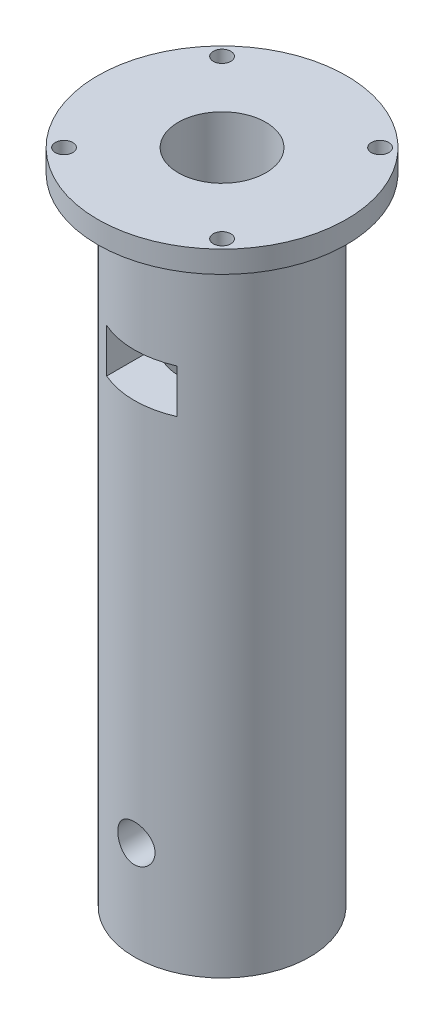
ISO-10303-21;
HEADER;
FILE_DESCRIPTION(('STEP AP214'),'2;1');
FILE_NAME('part.step','',(''),(''),'','','');
FILE_SCHEMA(('AUTOMOTIVE_DESIGN { 1 0 10303 214 1 1 1 1 }'));
ENDSEC;
DATA;
#1=APPLICATION_CONTEXT('core data for automotive mechanical design processes');
#2=APPLICATION_PROTOCOL_DEFINITION('international standard','automotive_design',2000,#1);
#3=PRODUCT_CONTEXT('',#1,'mechanical');
#4=PRODUCT('Part','Part','',(#3));
#5=PRODUCT_RELATED_PRODUCT_CATEGORY('part','',(#4));
#6=PRODUCT_DEFINITION_FORMATION('','',#4);
#7=PRODUCT_DEFINITION_CONTEXT('part definition',#1,'design');
#8=PRODUCT_DEFINITION('design','',#6,#7);
#9=PRODUCT_DEFINITION_SHAPE('','',#8);
#10=(LENGTH_UNIT() NAMED_UNIT(*) SI_UNIT(.MILLI.,.METRE.));
#11=(NAMED_UNIT(*) PLANE_ANGLE_UNIT() SI_UNIT($,.RADIAN.));
#12=(NAMED_UNIT(*) SI_UNIT($,.STERADIAN.) SOLID_ANGLE_UNIT());
#13=UNCERTAINTY_MEASURE_WITH_UNIT(LENGTH_MEASURE(1.E-05),#10,'distance_accuracy_value','');
#14=(GEOMETRIC_REPRESENTATION_CONTEXT(3) GLOBAL_UNCERTAINTY_ASSIGNED_CONTEXT((#13)) GLOBAL_UNIT_ASSIGNED_CONTEXT((#10,
#11,#12)) REPRESENTATION_CONTEXT('',''));
#15=CARTESIAN_POINT('',(0.,0.,0.));
#16=DIRECTION('',(0.,0.,1.));
#17=DIRECTION('',(1.,0.,0.));
#18=AXIS2_PLACEMENT_3D('',#15,#16,#17);
#19=CARTESIAN_POINT('',(0.,45.,0.));
#20=DIRECTION('',(0.,-1.,0.));
#21=DIRECTION('',(0.,0.,-1.));
#22=AXIS2_PLACEMENT_3D('',#19,#20,#21);
#23=CYLINDRICAL_SURFACE('',#22,20.);
#24=CARTESIAN_POINT('',(0.,145.,0.));
#25=DIRECTION('',(0.,1.,0.));
#26=DIRECTION('',(0.,0.,1.));
#27=AXIS2_PLACEMENT_3D('',#24,#25,#26);
#28=CIRCLE('',#27,20.);
#29=CARTESIAN_POINT('',(0.,145.,20.));
#30=VERTEX_POINT('',#29);
#31=EDGE_CURVE('E200',#30,#30,#28,.T.);
#32=ORIENTED_EDGE('',*,*,#31,.F.);
#33=EDGE_LOOP('',(#32));
#34=FACE_BOUND('',#33,.T.);
#35=CARTESIAN_POINT('',(0.,26.75,-20.));
#36=CARTESIAN_POINT('',(-0.235882160273438,26.7499917205021,-19.999995634548));
#37=CARTESIAN_POINT('',(-0.471865909834786,26.7302958936483,-19.9957844191217));
#38=CARTESIAN_POINT('',(-0.937141547842627,26.6521081818069,-19.9793916051107));
#39=CARTESIAN_POINT('',(-1.16642833988831,26.5935875148462,-19.9672040935584));
#40=CARTESIAN_POINT('',(-1.61151761134815,26.4396569333726,-19.936217016643));
#41=CARTESIAN_POINT('',(-1.82733352136637,26.3442844655771,-19.9174241649992));
#42=CARTESIAN_POINT('',(-2.23989055102827,26.1194738600792,-19.8752596894785));
#43=CARTESIAN_POINT('',(-2.43663238143512,25.990036992397,-19.8518882363135));
#44=CARTESIAN_POINT('',(-2.80845579164892,25.6986893561894,-19.8027339133299));
#45=CARTESIAN_POINT('',(-2.98320598382066,25.5363604343719,-19.7769225435023));
#46=CARTESIAN_POINT('',(-3.30321351462314,25.1847347309497,-19.726000511966));
#47=CARTESIAN_POINT('',(-3.4484683390828,24.99543565276,-19.7008899101478));
#48=CARTESIAN_POINT('',(-3.706806366207,24.592815620429,-19.6539325008399));
#49=CARTESIAN_POINT('',(-3.81954007648782,24.3792657719164,-19.632122266365));
#50=CARTESIAN_POINT('',(-4.00739494471044,23.9357135911783,-19.5946426811725));
#51=CARTESIAN_POINT('',(-4.08252032991898,23.7057131113665,-19.5789726403254));
#52=CARTESIAN_POINT('',(-4.19193740664846,23.2393734729951,-19.5558372982232));
#53=CARTESIAN_POINT('',(-4.22681404286624,23.0031775071053,-19.5482545883317));
#54=CARTESIAN_POINT('',(-4.25656176589869,22.5281744386785,-19.541799580002));
#55=CARTESIAN_POINT('',(-4.25143748517181,22.2893676416973,-19.5429262729382));
#56=CARTESIAN_POINT('',(-4.2018003152417,21.8202465759967,-19.5536563396257));
#57=CARTESIAN_POINT('',(-4.15796385505466,21.58985690344,-19.5631141344988));
#58=CARTESIAN_POINT('',(-4.03321699913495,21.1397783208176,-19.5892109090226));
#59=CARTESIAN_POINT('',(-3.95230462854138,20.9200899814517,-19.6058502711991));
#60=CARTESIAN_POINT('',(-3.7550732225969,20.4957323090477,-19.6445806364762));
#61=CARTESIAN_POINT('',(-3.63849136058396,20.2911889558839,-19.666711869015));
#62=CARTESIAN_POINT('',(-3.37341532036452,19.9043168250017,-19.7139072819128));
#63=CARTESIAN_POINT('',(-3.22491702414367,19.7219909186481,-19.7389718405537));
#64=CARTESIAN_POINT('',(-2.89662873087614,19.3808317876653,-19.7898364672849));
#65=CARTESIAN_POINT('',(-2.7162628010091,19.2225529321306,-19.8156411159268));
#66=CARTESIAN_POINT('',(-2.3312591445285,18.9384031135338,-19.8646124394905));
#67=CARTESIAN_POINT('',(-2.12662102486609,18.8125326753784,-19.8877790716819));
#68=CARTESIAN_POINT('',(-1.69822610079556,18.596647564086,-19.9289328017472));
#69=CARTESIAN_POINT('',(-1.4744332622891,18.506702357804,-19.9469098463489));
#70=CARTESIAN_POINT('',(-1.01444427212059,18.3658448663377,-19.975583671037));
#71=CARTESIAN_POINT('',(-0.778249825473837,18.3149272304461,-19.9862814490933));
#72=CARTESIAN_POINT('',(-0.304920474051216,18.2543692167667,-19.9990503897357));
#73=CARTESIAN_POINT('',(-0.0678866616700645,18.2439710985793,-20.0012798940608));
#74=CARTESIAN_POINT('',(0.404531063627258,18.2626979560572,-19.997303462698));
#75=CARTESIAN_POINT('',(0.639915080891646,18.2918204089846,-19.9910980654396));
#76=CARTESIAN_POINT('',(1.09986348604265,18.3881329457467,-19.971048714765));
#77=CARTESIAN_POINT('',(1.32451423637387,18.4549285413183,-19.9572839566272));
#78=CARTESIAN_POINT('',(1.7594245366201,18.6242557401821,-19.9236553710886));
#79=CARTESIAN_POINT('',(1.96968290728063,18.7267902675973,-19.9037910446432));
#80=CARTESIAN_POINT('',(2.37299466325105,18.9662841411997,-19.8597746945902));
#81=CARTESIAN_POINT('',(2.5657753745508,19.1036924197117,-19.835568065625));
#82=CARTESIAN_POINT('',(2.92581438161099,19.4084387504517,-19.7856691939394));
#83=CARTESIAN_POINT('',(3.09306955679065,19.5757804567165,-19.7599767701044));
#84=CARTESIAN_POINT('',(3.40028132560014,19.9391114616347,-19.7094595502391));
#85=CARTESIAN_POINT('',(3.53971470209231,20.1355468972746,-19.6846575011254));
#86=CARTESIAN_POINT('',(3.78361259042945,20.5494933847941,-19.6392395261037));
#87=CARTESIAN_POINT('',(3.88807858308299,20.7670035436921,-19.6186234229427));
#88=CARTESIAN_POINT('',(4.05839186252609,21.2157776462395,-19.5841010629306));
#89=CARTESIAN_POINT('',(4.12445130926692,21.4469581057331,-19.5701580208428));
#90=CARTESIAN_POINT('',(4.21670597681273,21.9174700877127,-19.5504899175105));
#91=CARTESIAN_POINT('',(4.24290716364494,22.1568003848383,-19.5447636263811));
#92=CARTESIAN_POINT('',(4.25445882074592,22.6315507853017,-19.5422517596013));
#93=CARTESIAN_POINT('',(4.24063785769818,22.8669501510923,-19.5452848378007));
#94=CARTESIAN_POINT('',(4.17438177976061,23.3319845849334,-19.5595415222697));
#95=CARTESIAN_POINT('',(4.12194706810125,23.5616197131519,-19.5707650430092));
#96=CARTESIAN_POINT('',(3.9803419391464,24.007993740043,-19.6000520686151));
#97=CARTESIAN_POINT('',(3.89128563781047,24.2247703270653,-19.6180943117547));
#98=CARTESIAN_POINT('',(3.67906583788464,24.640430642762,-19.658995430057));
#99=CARTESIAN_POINT('',(3.55589901837016,24.8393126267584,-19.6818547741501));
#100=CARTESIAN_POINT('',(3.27617829793216,25.2176369818626,-19.7303606499532));
#101=CARTESIAN_POINT('',(3.11903117114265,25.3966350637243,-19.7560521086617));
#102=CARTESIAN_POINT('',(2.77702080075196,25.7259927338104,-19.8070186912309));
#103=CARTESIAN_POINT('',(2.59215117602445,25.8763457104056,-19.8322937177473));
#104=CARTESIAN_POINT('',(2.19725114425488,26.1458785672646,-19.8799415519951));
#105=CARTESIAN_POINT('',(1.98694346554049,26.2646594199828,-19.9022755605413));
#106=CARTESIAN_POINT('',(1.548924146271,26.4650003636837,-19.9411384569439));
#107=CARTESIAN_POINT('',(1.32122767563642,26.5465924745331,-19.9576723359316));
#108=CARTESIAN_POINT('',(0.911002541574341,26.6552643600848,-19.9800317732193));
#109=CARTESIAN_POINT('',(0.730734728352712,26.6907239862831,-19.9874743622358));
#110=CARTESIAN_POINT('',(0.366998358221396,26.7380945590935,-19.9974600765193));
#111=CARTESIAN_POINT('',(0.183529928855793,26.750006441927,-20.0000033965735));
#112=CARTESIAN_POINT('',(0.,26.75,-20.));
#113=B_SPLINE_CURVE_WITH_KNOTS('',3,(#35,#36,#37,#38,#39,#40,#41,#42,#43,#44,#45,#46,#47,#48,
#49,#50,#51,#52,#53,#54,#55,#56,#57,#58,#59,#60,#61,#62,#63,#64,#65,#66,#67,#68,#69,#70,#71,#72,
#73,#74,#75,#76,#77,#78,#79,#80,#81,#82,#83,#84,#85,#86,#87,#88,#89,#90,#91,#92,#93,#94,#95,#96,
#97,#98,#99,#100,#101,#102,#103,#104,#105,#106,#107,#108,#109,#110,#111,#112),.UNSPECIFIED.,.T.,
.F.,(4,2,2,2,2,2,2,2,2,2,2,2,2,2,2,2,2,2,2,2,2,2,2,2,2,2,2,2,2,2,2,2,2,2,2,2,2,2,4),(0.,
0.706974821530038,1.41447433038575,2.12125680084935,2.82801292413439,3.54439188883226,
4.26083189172154,4.98470651704243,5.70849975882414,6.42163593849384,7.13468953193895,
7.83552493982339,8.53639768228291,9.24256444453978,9.94882237463958,10.6694706484024,
11.3901305934923,12.1121773742571,12.8341251441853,13.5425053530055,14.250840345535,
14.9518922730208,15.6530015733315,16.3636397455873,17.0743647262229,17.7974044480911,
18.5204135465957,19.2393897935185,19.9582584127106,20.6623515836126,21.3664374020091,
22.0683456578021,22.7703222738673,23.4857180270857,24.2012787025927,24.9254939602125,
25.649084478056,26.1991735460672,26.7492407429584),.UNSPECIFIED.);
#114=CARTESIAN_POINT('',(0.,26.75,-20.));
#115=VERTEX_POINT('',#114);
#116=EDGE_CURVE('E162',#115,#115,#113,.T.);
#117=ORIENTED_EDGE('',*,*,#116,.T.);
#118=EDGE_LOOP('',(#117));
#119=FACE_BOUND('',#118,.T.);
#120=CARTESIAN_POINT('',(0.,18.25,20.));
#121=CARTESIAN_POINT('',(-0.235882160273438,18.2500082794979,19.999995634548));
#122=CARTESIAN_POINT('',(-0.471865909834786,18.2697041063517,19.9957844191217));
#123=CARTESIAN_POINT('',(-0.937141547842627,18.3478918181931,19.9793916051107));
#124=CARTESIAN_POINT('',(-1.16642833988831,18.4064124851538,19.9672040935584));
#125=CARTESIAN_POINT('',(-1.61151761134815,18.5603430666274,19.936217016643));
#126=CARTESIAN_POINT('',(-1.82733352136637,18.6557155344229,19.9174241649992));
#127=CARTESIAN_POINT('',(-2.23989055102827,18.8805261399208,19.8752596894785));
#128=CARTESIAN_POINT('',(-2.43663238143512,19.009963007603,19.8518882363135));
#129=CARTESIAN_POINT('',(-2.80845579164892,19.3013106438106,19.8027339133299));
#130=CARTESIAN_POINT('',(-2.98320598382066,19.4636395656281,19.7769225435023));
#131=CARTESIAN_POINT('',(-3.30321351462314,19.8152652690503,19.726000511966));
#132=CARTESIAN_POINT('',(-3.4484683390828,20.00456434724,19.7008899101478));
#133=CARTESIAN_POINT('',(-3.706806366207,20.407184379571,19.6539325008399));
#134=CARTESIAN_POINT('',(-3.81954007648782,20.6207342280836,19.632122266365));
#135=CARTESIAN_POINT('',(-4.00739494471043,21.0642864088217,19.5946426811725));
#136=CARTESIAN_POINT('',(-4.08252032991898,21.2942868886335,19.5789726403254));
#137=CARTESIAN_POINT('',(-4.19193740664846,21.7606265270049,19.5558372982232));
#138=CARTESIAN_POINT('',(-4.22681404286624,21.9968224928947,19.5482545883317));
#139=CARTESIAN_POINT('',(-4.25656176589869,22.4718255613215,19.541799580002));
#140=CARTESIAN_POINT('',(-4.25143748517181,22.7106323583027,19.5429262729382));
#141=CARTESIAN_POINT('',(-4.2018003152417,23.1797534240033,19.5536563396257));
#142=CARTESIAN_POINT('',(-4.15796385505466,23.41014309656,19.5631141344988));
#143=CARTESIAN_POINT('',(-4.03321699913495,23.8602216791824,19.5892109090226));
#144=CARTESIAN_POINT('',(-3.95230462854138,24.0799100185483,19.6058502711991));
#145=CARTESIAN_POINT('',(-3.7550732225969,24.5042676909523,19.6445806364762));
#146=CARTESIAN_POINT('',(-3.63849136058396,24.7088110441161,19.666711869015));
#147=CARTESIAN_POINT('',(-3.37341532036452,25.0956831749983,19.7139072819128));
#148=CARTESIAN_POINT('',(-3.22491702414367,25.2780090813519,19.7389718405537));
#149=CARTESIAN_POINT('',(-2.89662873087614,25.6191682123347,19.7898364672849));
#150=CARTESIAN_POINT('',(-2.7162628010091,25.7774470678694,19.8156411159268));
#151=CARTESIAN_POINT('',(-2.3312591445285,26.0615968864662,19.8646124394905));
#152=CARTESIAN_POINT('',(-2.12662102486609,26.1874673246216,19.8877790716819));
#153=CARTESIAN_POINT('',(-1.69822610079555,26.403352435914,19.9289328017472));
#154=CARTESIAN_POINT('',(-1.4744332622891,26.493297642196,19.9469098463489));
#155=CARTESIAN_POINT('',(-1.01444427212058,26.6341551336623,19.975583671037));
#156=CARTESIAN_POINT('',(-0.778249825473835,26.6850727695539,19.9862814490933));
#157=CARTESIAN_POINT('',(-0.304920474051215,26.7456307832333,19.9990503897357));
#158=CARTESIAN_POINT('',(-0.0678866616700645,26.7560289014207,20.0012798940608));
#159=CARTESIAN_POINT('',(0.404531063627257,26.7373020439428,19.997303462698));
#160=CARTESIAN_POINT('',(0.639915080891646,26.7081795910154,19.9910980654396));
#161=CARTESIAN_POINT('',(1.09986348604265,26.6118670542533,19.971048714765));
#162=CARTESIAN_POINT('',(1.32451423637387,26.5450714586817,19.9572839566272));
#163=CARTESIAN_POINT('',(1.7594245366201,26.3757442598179,19.9236553710886));
#164=CARTESIAN_POINT('',(1.96968290728063,26.2732097324027,19.9037910446432));
#165=CARTESIAN_POINT('',(2.37299466325105,26.0337158588003,19.8597746945902));
#166=CARTESIAN_POINT('',(2.5657753745508,25.8963075802883,19.835568065625));
#167=CARTESIAN_POINT('',(2.92581438161099,25.5915612495483,19.7856691939394));
#168=CARTESIAN_POINT('',(3.09306955679065,25.4242195432835,19.7599767701044));
#169=CARTESIAN_POINT('',(3.40028132560014,25.0608885383653,19.7094595502391));
#170=CARTESIAN_POINT('',(3.53971470209231,24.8644531027254,19.6846575011254));
#171=CARTESIAN_POINT('',(3.78361259042945,24.4505066152059,19.6392395261037));
#172=CARTESIAN_POINT('',(3.88807858308299,24.2329964563079,19.6186234229427));
#173=CARTESIAN_POINT('',(4.05839186252609,23.7842223537605,19.5841010629306));
#174=CARTESIAN_POINT('',(4.12445130926692,23.5530418942669,19.5701580208428));
#175=CARTESIAN_POINT('',(4.21670597681273,23.0825299122873,19.5504899175105));
#176=CARTESIAN_POINT('',(4.24290716364494,22.8431996151617,19.5447636263811));
#177=CARTESIAN_POINT('',(4.25445882074592,22.3684492146983,19.5422517596013));
#178=CARTESIAN_POINT('',(4.24063785769818,22.1330498489077,19.5452848378007));
#179=CARTESIAN_POINT('',(4.17438177976061,21.6680154150666,19.5595415222697));
#180=CARTESIAN_POINT('',(4.12194706810125,21.4383802868481,19.5707650430092));
#181=CARTESIAN_POINT('',(3.9803419391464,20.992006259957,19.6000520686151));
#182=CARTESIAN_POINT('',(3.89128563781047,20.7752296729347,19.6180943117547));
#183=CARTESIAN_POINT('',(3.67906583788464,20.359569357238,19.658995430057));
#184=CARTESIAN_POINT('',(3.55589901837016,20.1606873732416,19.6818547741501));
#185=CARTESIAN_POINT('',(3.27617829793216,19.7823630181374,19.7303606499532));
#186=CARTESIAN_POINT('',(3.11903117114265,19.6033649362757,19.7560521086616));
#187=CARTESIAN_POINT('',(2.77702080075196,19.2740072661896,19.8070186912309));
#188=CARTESIAN_POINT('',(2.59215117602445,19.1236542895944,19.8322937177474));
#189=CARTESIAN_POINT('',(2.19725114425488,18.8541214327354,19.8799415519951));
#190=CARTESIAN_POINT('',(1.98694346554049,18.7353405800172,19.9022755605413));
#191=CARTESIAN_POINT('',(1.548924146271,18.5349996363163,19.9411384569439));
#192=CARTESIAN_POINT('',(1.32122767563642,18.4534075254669,19.9576723359316));
#193=CARTESIAN_POINT('',(0.911002541574342,18.3447356399152,19.9800317732193));
#194=CARTESIAN_POINT('',(0.730734728352713,18.3092760137169,19.9874743622358));
#195=CARTESIAN_POINT('',(0.366998358221397,18.2619054409065,19.9974600765193));
#196=CARTESIAN_POINT('',(0.183529928855794,18.249993558073,20.0000033965735));
#197=CARTESIAN_POINT('',(0.,18.25,20.));
#198=B_SPLINE_CURVE_WITH_KNOTS('',3,(#120,#121,#122,#123,#124,#125,#126,#127,#128,#129,#130,
#131,#132,#133,#134,#135,#136,#137,#138,#139,#140,#141,#142,#143,#144,#145,#146,#147,#148,#149,
#150,#151,#152,#153,#154,#155,#156,#157,#158,#159,#160,#161,#162,#163,#164,#165,#166,#167,#168,
#169,#170,#171,#172,#173,#174,#175,#176,#177,#178,#179,#180,#181,#182,#183,#184,#185,#186,#187,
#188,#189,#190,#191,#192,#193,#194,#195,#196,#197),.UNSPECIFIED.,.T.,.F.,(4,2,2,2,2,2,2,2,2,2,2,
2,2,2,2,2,2,2,2,2,2,2,2,2,2,2,2,2,2,2,2,2,2,2,2,2,2,2,4),(0.,0.706974821530038,1.41447433038575,
2.12125680084935,2.8280129241344,3.54439188883226,4.26083189172155,4.98470651704243,
5.70849975882414,6.42163593849384,7.13468953193895,7.83552493982339,8.53639768228291,
9.24256444453978,9.94882237463958,10.6694706484024,11.3901305934923,12.1121773742571,
12.8341251441853,13.5425053530055,14.250840345535,14.9518922730208,15.6530015733315,
16.3636397455873,17.0743647262229,17.7974044480911,18.5204135465957,19.2393897935185,
19.9582584127106,20.6623515836126,21.3664374020091,22.0683456578021,22.7703222738673,
23.4857180270857,24.2012787025927,24.9254939602125,25.649084478056,26.1991735460672,
26.7492407429584),.UNSPECIFIED.);
#199=CARTESIAN_POINT('',(0.,18.25,20.));
#200=VERTEX_POINT('',#199);
#201=EDGE_CURVE('E171',#200,#200,#198,.T.);
#202=ORIENTED_EDGE('',*,*,#201,.T.);
#203=EDGE_LOOP('',(#202));
#204=FACE_BOUND('',#203,.T.);
#205=CARTESIAN_POINT('',(0.,0.,0.));
#206=DIRECTION('',(0.,1.,0.));
#207=DIRECTION('',(0.,0.,1.));
#208=AXIS2_PLACEMENT_3D('',#205,#206,#207);
#209=CIRCLE('',#208,20.);
#210=CARTESIAN_POINT('',(0.,0.,20.));
#211=VERTEX_POINT('',#210);
#212=EDGE_CURVE('E231',#211,#211,#209,.T.);
#213=ORIENTED_EDGE('',*,*,#212,.T.);
#214=EDGE_LOOP('',(#213));
#215=FACE_BOUND('',#214,.T.);
#216=DIRECTION('',(0.,-1.,0.));
#217=VECTOR('',#216,1.);
#218=CARTESIAN_POINT('',(-8.,45.,18.3303027798234));
#219=LINE('',#218,#217);
#220=CARTESIAN_POINT('',(-8.,120.,18.3303027798234));
#221=VERTEX_POINT('',#220);
#222=CARTESIAN_POINT('',(-8.,110.,18.3303027798234));
#223=VERTEX_POINT('',#222);
#224=EDGE_CURVE('E103',#221,#223,#219,.T.);
#225=ORIENTED_EDGE('',*,*,#224,.F.);
#226=CARTESIAN_POINT('',(0.,120.,0.));
#227=DIRECTION('',(0.,-1.,0.));
#228=DIRECTION('',(0.,0.,-1.));
#229=AXIS2_PLACEMENT_3D('',#226,#227,#228);
#230=CIRCLE('',#229,20.);
#231=CARTESIAN_POINT('',(8.,120.,18.3303027798234));
#232=VERTEX_POINT('',#231);
#233=EDGE_CURVE('E92',#232,#221,#230,.T.);
#234=ORIENTED_EDGE('',*,*,#233,.F.);
#235=DIRECTION('',(0.,-1.,0.));
#236=VECTOR('',#235,1.);
#237=CARTESIAN_POINT('',(8.00000000000002,45.,18.3303027798234));
#238=LINE('',#237,#236);
#239=CARTESIAN_POINT('',(8.,110.,18.3303027798234));
#240=VERTEX_POINT('',#239);
#241=EDGE_CURVE('E98',#240,#232,#238,.F.);
#242=ORIENTED_EDGE('',*,*,#241,.F.);
#243=CARTESIAN_POINT('',(0.,110.,0.));
#244=DIRECTION('',(0.,1.,0.));
#245=DIRECTION('',(0.,0.,1.));
#246=AXIS2_PLACEMENT_3D('',#243,#244,#245);
#247=CIRCLE('',#246,20.);
#248=EDGE_CURVE('E110',#223,#240,#247,.T.);
#249=ORIENTED_EDGE('',*,*,#248,.F.);
#250=EDGE_LOOP('',(#225,#234,#242,#249));
#251=FACE_BOUND('',#250,.T.);
#252=ADVANCED_FACE('F53',(#34,#119,#204,#215,#251),#23,.T.);
#253=CARTESIAN_POINT('',(0.,45.,0.));
#254=DIRECTION('',(0.,-1.,0.));
#255=DIRECTION('',(0.,0.,-1.));
#256=AXIS2_PLACEMENT_3D('',#253,#254,#255);
#257=CYLINDRICAL_SURFACE('',#256,10.);
#258=CARTESIAN_POINT('',(0.,26.75,-10.));
#259=CARTESIAN_POINT('',(-0.113677010701556,26.7499991489818,-9.9999993202227));
#260=CARTESIAN_POINT('',(-0.22739000284068,26.745432746214,-9.99805623880879));
#261=CARTESIAN_POINT('',(-0.454001998651723,26.727211761547,-9.99033301490753));
#262=CARTESIAN_POINT('',(-0.566900458780561,26.7135515928012,-9.98455051363963));
#263=CARTESIAN_POINT('',(-0.79123203865508,26.6772455171717,-9.96928310683869));
#264=CARTESIAN_POINT('',(-0.902661766499217,26.6545816486137,-9.95979080115523));
#265=CARTESIAN_POINT('',(-1.12303885960079,26.6005099312634,-9.93735816549744));
#266=CARTESIAN_POINT('',(-1.23198519049179,26.5690985084824,-9.92441642628079));
#267=CARTESIAN_POINT('',(-1.55313632601812,26.4624375156391,-9.88099824492704));
#268=CARTESIAN_POINT('',(-1.76068359514815,26.3745916871478,-9.84585421260864));
#269=CARTESIAN_POINT('',(-2.15778395929118,26.168326313854,-9.7665299348061));
#270=CARTESIAN_POINT('',(-2.34734208206892,26.0499153462874,-9.72235222508786));
#271=CARTESIAN_POINT('',(-2.71333279483057,25.7794096949561,-9.62679879188588));
#272=CARTESIAN_POINT('',(-2.8887188806256,25.6259855552551,-9.575181288256));
#273=CARTESIAN_POINT('',(-3.21223227660989,25.2924935524296,-9.47156108494723));
#274=CARTESIAN_POINT('',(-3.36034469204757,25.1124112269475,-9.41955819082848));
#275=CARTESIAN_POINT('',(-3.56273269354907,24.8204473625352,-9.34411580631012));
#276=CARTESIAN_POINT('',(-3.62823008995036,24.7166537667449,-9.31881195375772));
#277=CARTESIAN_POINT('',(-3.75018577037821,24.5034148828343,-9.27040479675505));
#278=CARTESIAN_POINT('',(-3.80664774818123,24.3939719285577,-9.24730059463674));
#279=CARTESIAN_POINT('',(-3.91004416781592,24.1701080192539,-9.20405886451464));
#280=CARTESIAN_POINT('',(-3.95697833662412,24.05568692169,-9.18392142152913));
#281=CARTESIAN_POINT('',(-4.04082235096461,23.8227126632695,-9.14734105992767));
#282=CARTESIAN_POINT('',(-4.07773741915296,23.7041616916992,-9.13089621724511));
#283=CARTESIAN_POINT('',(-4.13958476495511,23.4696950739208,-9.10301776019469));
#284=CARTESIAN_POINT('',(-4.16501622792425,23.3539356491891,-9.09137781079844));
#285=CARTESIAN_POINT('',(-4.20614460615987,23.120400233497,-9.07242317616999));
#286=CARTESIAN_POINT('',(-4.22184607462374,23.0026252123001,-9.06510646793109));
#287=CARTESIAN_POINT('',(-4.24332956160536,22.7660108844064,-9.05507017158341));
#288=CARTESIAN_POINT('',(-4.24911439144241,22.6471718889482,-9.05234928058578));
#289=CARTESIAN_POINT('',(-4.25069723023711,22.4094178270002,-9.05160615463458));
#290=CARTESIAN_POINT('',(-4.24649579741935,22.290502765134,-9.05358365704434));
#291=CARTESIAN_POINT('',(-4.22890119912732,22.0631706627865,-9.06181439560418));
#292=CARTESIAN_POINT('',(-4.21627687697757,21.9546806086182,-9.06770983718672));
#293=CARTESIAN_POINT('',(-4.18277997451473,21.7392397546982,-9.08320870709349));
#294=CARTESIAN_POINT('',(-4.16190470602441,21.6322894683881,-9.09281334385862));
#295=CARTESIAN_POINT('',(-4.0871927408374,21.3148858688075,-9.12677022909441));
#296=CARTESIAN_POINT('',(-4.02125514058214,21.1076941811695,-9.15627293981543));
#297=CARTESIAN_POINT('',(-3.85774261830499,20.7030393843711,-9.22636545447978));
#298=CARTESIAN_POINT('',(-3.75951307498226,20.5058843910904,-9.26718166298623));
#299=CARTESIAN_POINT('',(-3.53465124820333,20.1300387495081,-9.35525552477842));
#300=CARTESIAN_POINT('',(-3.40800751748348,19.9513555854778,-9.40251577116418));
#301=CARTESIAN_POINT('',(-3.11680324432193,19.6009646690315,-9.50322425434588));
#302=CARTESIAN_POINT('',(-2.94988263455247,19.4312646318276,-9.55685048537027));
#303=CARTESIAN_POINT('',(-2.58944180731014,19.1215743859644,-9.66074261888042));
#304=CARTESIAN_POINT('',(-2.39591487047007,18.9815917051483,-9.71100766772567));
#305=CARTESIAN_POINT('',(-1.9814460978145,18.7322059695585,-9.80408225808898));
#306=CARTESIAN_POINT('',(-1.75994172476466,18.6236509161229,-9.84667505152035));
#307=CARTESIAN_POINT('',(-1.29954134540696,18.4460550513539,-9.91792875212495));
#308=CARTESIAN_POINT('',(-1.06065543890027,18.3769914963459,-9.94659767680175));
#309=CARTESIAN_POINT('',(-0.58901802718886,18.2846130848163,-9.98525693893447));
#310=CARTESIAN_POINT('',(-0.356883589560016,18.2586067785362,-9.99634415287782));
#311=CARTESIAN_POINT('',(0.108679830348575,18.2450178225928,-10.0021156610579));
#312=CARTESIAN_POINT('',(0.342108400378223,18.2574235679834,-9.99680490940531));
#313=CARTESIAN_POINT('',(0.790820295706892,18.3184079919149,-9.97108450072209));
#314=CARTESIAN_POINT('',(1.00641547026157,18.3650690104666,-9.95147565148115));
#315=CARTESIAN_POINT('',(1.42646420236818,18.4905404964648,-9.90000027628473));
#316=CARTESIAN_POINT('',(1.63091636321827,18.5693549836747,-9.86813221773541));
#317=CARTESIAN_POINT('',(2.03008552099075,18.7594578455322,-9.79394056474646));
#318=CARTESIAN_POINT('',(2.22429988301423,18.8716825322167,-9.75132182595808));
#319=CARTESIAN_POINT('',(2.59184226357495,19.1244060712437,-9.66013805917468));
#320=CARTESIAN_POINT('',(2.76516136974161,19.2649169206318,-9.61157051153782));
#321=CARTESIAN_POINT('',(3.09950633765641,19.5823642859663,-9.50925140592673));
#322=CARTESIAN_POINT('',(3.25866563312504,19.7612300558849,-9.45538259913105));
#323=CARTESIAN_POINT('',(3.54531249912718,20.144078438966,-9.35168739183024));
#324=CARTESIAN_POINT('',(3.67279176527431,20.3480676168929,-9.30186205355252));
#325=CARTESIAN_POINT('',(3.83822490191957,20.6709171853981,-9.23426540442613));
#326=CARTESIAN_POINT('',(3.88940372033199,20.7824005044652,-9.2127671263081));
#327=CARTESIAN_POINT('',(3.98209310208837,21.0098685537565,-9.17308443883657));
#328=CARTESIAN_POINT('',(4.02360794786299,21.1258512634653,-9.1548985624269));
#329=CARTESIAN_POINT('',(4.09650697370751,21.3614343359345,-9.12251191219804));
#330=CARTESIAN_POINT('',(4.12789616880964,21.4810328756442,-9.10830916607081));
#331=CARTESIAN_POINT('',(4.18019034551947,21.7229441646869,-9.08442835397214));
#332=CARTESIAN_POINT('',(4.20109637044893,21.8452566426534,-9.07474983774001));
#333=CARTESIAN_POINT('',(4.23090857482752,22.0817150177811,-9.06088620883668));
#334=CARTESIAN_POINT('',(4.24063765754596,22.1957357492731,-9.05632506405752));
#335=CARTESIAN_POINT('',(4.25086655818531,22.4243219448072,-9.05152837470597));
#336=CARTESIAN_POINT('',(4.25136329161359,22.5388875781124,-9.05129427578321));
#337=CARTESIAN_POINT('',(4.24311097533725,22.7675548115736,-9.05516608854555));
#338=CARTESIAN_POINT('',(4.23436691354737,22.8816566287285,-9.05926965888216));
#339=CARTESIAN_POINT('',(4.20775610530269,23.1085751379209,-9.07165858349788));
#340=CARTESIAN_POINT('',(4.18988592085188,23.221391329251,-9.07994551372018));
#341=CARTESIAN_POINT('',(4.12512147022873,23.5452481672725,-9.10964571470631));
#342=CARTESIAN_POINT('',(4.06657122964406,23.7536192588993,-9.1361655079803));
#343=CARTESIAN_POINT('',(3.91938458598325,24.1574818696945,-9.2002602527255));
#344=CARTESIAN_POINT('',(3.83073965904677,24.3529697211292,-9.23783833588634));
#345=CARTESIAN_POINT('',(3.61959902632087,24.7388049936898,-9.32267067208766));
#346=CARTESIAN_POINT('',(3.49535824540964,24.9280987634013,-9.37037755592548));
#347=CARTESIAN_POINT('',(3.21898596659377,25.2841542875505,-9.46887884692679));
#348=CARTESIAN_POINT('',(3.06684418255118,25.450907692619,-9.5196743881401));
#349=CARTESIAN_POINT('',(2.72492668123888,25.7704806952933,-9.62335420844412));
#350=CARTESIAN_POINT('',(2.53315443575609,25.9212365763749,-9.67609784486143));
#351=CARTESIAN_POINT('',(2.22741156399471,26.1216108468576,-9.7493443543597));
#352=CARTESIAN_POINT('',(2.12238957215071,26.1841497236724,-9.77279852905516));
#353=CARTESIAN_POINT('',(1.90693593814687,26.3001362112189,-9.81711050493702));
#354=CARTESIAN_POINT('',(1.79650682648898,26.3535880232472,-9.83796950476888));
#355=CARTESIAN_POINT('',(1.57262713778778,26.4501892279014,-9.87621165882794));
#356=CARTESIAN_POINT('',(1.4592447557043,26.4934783997518,-9.89364136255111));
#357=CARTESIAN_POINT('',(1.22878834218433,26.5702972712934,-9.92489738464772));
#358=CARTESIAN_POINT('',(1.11171609947767,26.6038316215575,-9.9387254197725));
#359=CARTESIAN_POINT('',(0.875036387460942,26.6607200680094,-9.9623502955339));
#360=CARTESIAN_POINT('',(0.755435885359915,26.6840990757333,-9.97215699734158));
#361=CARTESIAN_POINT('',(0.51445853759862,26.7205049110775,-9.98748649093899));
#362=CARTESIAN_POINT('',(0.393083039839861,26.7335392168541,-9.99301237724913));
#363=CARTESIAN_POINT('',(0.226199863278973,26.744217783778,-9.99754373765534));
#364=CARTESIAN_POINT('',(0.18099404507961,26.7463854563052,-9.99846427489235));
#365=CARTESIAN_POINT('',(0.0905273865819351,26.7492767375528,-9.99969254297849));
#366=CARTESIAN_POINT('',(0.0452665460030454,26.7500003388781,-10.0000002706895));
#367=CARTESIAN_POINT('',(0.,26.75,-10.));
#368=B_SPLINE_CURVE_WITH_KNOTS('',3,(#258,#259,#260,#261,#262,#263,#264,#265,#266,#267,#268,
#269,#270,#271,#272,#273,#274,#275,#276,#277,#278,#279,#280,#281,#282,#283,#284,#285,#286,#287,
#288,#289,#290,#291,#292,#293,#294,#295,#296,#297,#298,#299,#300,#301,#302,#303,#304,#305,#306,
#307,#308,#309,#310,#311,#312,#313,#314,#315,#316,#317,#318,#319,#320,#321,#322,#323,#324,#325,
#326,#327,#328,#329,#330,#331,#332,#333,#334,#335,#336,#337,#338,#339,#340,#341,#342,#343,#344,
#345,#346,#347,#348,#349,#350,#351,#352,#353,#354,#355,#356,#357,#358,#359,#360,#361,#362,#363,
#364,#365,#366,#367),.UNSPECIFIED.,.T.,.F.,(4,2,2,2,2,2,2,2,2,2,2,2,2,2,2,2,2,2,2,2,2,2,2,2,2,2,
2,2,2,2,2,2,2,2,2,2,2,2,2,2,2,2,2,2,2,2,2,2,2,2,2,2,2,2,4),(0.,0.340984938318924,
0.682179557735861,1.02405827938089,1.36607688788231,2.0470133561407,2.72775894631527,
3.4407382045737,4.15410568912276,4.52965078311537,4.90504195584266,5.28044388404752,
5.65564974902583,6.01244083677808,6.36906483610646,6.72558771751804,7.08209067003653,
7.40983435594,7.73768490962246,8.39283383458289,9.06217993015749,9.73179617189363,
10.4605154263028,11.1894190563265,11.9364680771258,12.6830864280958,13.3809800136215,
14.0786627739841,14.7400078846904,15.4014357008125,16.0834964145367,16.7658470233297,
17.4988311874153,18.2320072887681,18.605210530717,18.9782480776172,19.3511005817984,
19.7239159710255,20.0670475382192,20.4102937422991,20.7533547665626,21.0965451243304,
21.7475903075052,22.3988200433388,23.0900586865992,23.781552679893,24.5263289253326,
24.8993296673328,25.2721574850899,25.6395096843311,26.0066864617427,26.3729573794923,
26.7389632792289,26.874743867228,27.0105251505455),.UNSPECIFIED.);
#369=CARTESIAN_POINT('',(0.,26.75,-10.));
#370=VERTEX_POINT('',#369);
#371=EDGE_CURVE('E161',#370,#370,#368,.T.);
#372=ORIENTED_EDGE('',*,*,#371,.F.);
#373=EDGE_LOOP('',(#372));
#374=FACE_BOUND('',#373,.T.);
#375=CARTESIAN_POINT('',(0.,18.25,10.));
#376=CARTESIAN_POINT('',(-0.113677010701556,18.2500008510182,9.9999993202227));
#377=CARTESIAN_POINT('',(-0.227390002840681,18.254567253786,9.99805623880879));
#378=CARTESIAN_POINT('',(-0.454001998651724,18.272788238453,9.99033301490753));
#379=CARTESIAN_POINT('',(-0.566900458780562,18.2864484071988,9.98455051363964));
#380=CARTESIAN_POINT('',(-0.79123203865508,18.3227544828283,9.96928310683869));
#381=CARTESIAN_POINT('',(-0.902661766499218,18.3454183513863,9.95979080115523));
#382=CARTESIAN_POINT('',(-1.12303885960079,18.3994900687366,9.93735816549744));
#383=CARTESIAN_POINT('',(-1.23198519049179,18.4309014915176,9.92441642628079));
#384=CARTESIAN_POINT('',(-1.55313632601812,18.5375624843609,9.88099824492704));
#385=CARTESIAN_POINT('',(-1.76068359514815,18.6254083128522,9.84585421260864));
#386=CARTESIAN_POINT('',(-2.15778395929118,18.831673686146,9.7665299348061));
#387=CARTESIAN_POINT('',(-2.34734208206891,18.9500846537126,9.72235222508786));
#388=CARTESIAN_POINT('',(-2.71333279483056,19.220590305044,9.62679879188588));
#389=CARTESIAN_POINT('',(-2.8887188806256,19.3740144447449,9.575181288256));
#390=CARTESIAN_POINT('',(-3.21223227660989,19.7075064475704,9.47156108494723));
#391=CARTESIAN_POINT('',(-3.36034469204757,19.8875887730525,9.41955819082848));
#392=CARTESIAN_POINT('',(-3.56273269354907,20.1795526374648,9.34411580631012));
#393=CARTESIAN_POINT('',(-3.62823008995036,20.2833462332551,9.31881195375772));
#394=CARTESIAN_POINT('',(-3.75018577037822,20.4965851171657,9.27040479675505));
#395=CARTESIAN_POINT('',(-3.80664774818124,20.6060280714424,9.24730059463674));
#396=CARTESIAN_POINT('',(-3.91004416781592,20.8298919807461,9.20405886451464));
#397=CARTESIAN_POINT('',(-3.95697833662412,20.94431307831,9.18392142152913));
#398=CARTESIAN_POINT('',(-4.04082235096461,21.1772873367305,9.14734105992767));
#399=CARTESIAN_POINT('',(-4.07773741915296,21.2958383083009,9.13089621724511));
#400=CARTESIAN_POINT('',(-4.13958476495511,21.5303049260792,9.10301776019469));
#401=CARTESIAN_POINT('',(-4.16501622792424,21.6460643508109,9.09137781079844));
#402=CARTESIAN_POINT('',(-4.20614460615987,21.879599766503,9.07242317616999));
#403=CARTESIAN_POINT('',(-4.22184607462374,21.9973747876999,9.06510646793109));
#404=CARTESIAN_POINT('',(-4.24332956160536,22.2339891155936,9.05507017158341));
#405=CARTESIAN_POINT('',(-4.24911439144241,22.3528281110518,9.05234928058578));
#406=CARTESIAN_POINT('',(-4.25069723023711,22.5905821729998,9.05160615463458));
#407=CARTESIAN_POINT('',(-4.24649579741935,22.709497234866,9.05358365704434));
#408=CARTESIAN_POINT('',(-4.22890119912732,22.9368293372135,9.06181439560418));
#409=CARTESIAN_POINT('',(-4.21627687697757,23.0453193913818,9.06770983718672));
#410=CARTESIAN_POINT('',(-4.18277997451473,23.2607602453018,9.08320870709349));
#411=CARTESIAN_POINT('',(-4.16190470602441,23.3677105316119,9.09281334385862));
#412=CARTESIAN_POINT('',(-4.0871927408374,23.6851141311925,9.12677022909441));
#413=CARTESIAN_POINT('',(-4.02125514058214,23.8923058188305,9.15627293981543));
#414=CARTESIAN_POINT('',(-3.85774261830499,24.2969606156289,9.22636545447978));
#415=CARTESIAN_POINT('',(-3.75951307498226,24.4941156089096,9.26718166298624));
#416=CARTESIAN_POINT('',(-3.53465124820333,24.8699612504919,9.35525552477842));
#417=CARTESIAN_POINT('',(-3.40800751748348,25.0486444145222,9.40251577116418));
#418=CARTESIAN_POINT('',(-3.11680324432193,25.3990353309685,9.50322425434588));
#419=CARTESIAN_POINT('',(-2.94988263455246,25.5687353681724,9.55685048537027));
#420=CARTESIAN_POINT('',(-2.58944180731014,25.8784256140356,9.66074261888042));
#421=CARTESIAN_POINT('',(-2.39591487047007,26.0184082948517,9.71100766772566));
#422=CARTESIAN_POINT('',(-1.9814460978145,26.2677940304415,9.80408225808898));
#423=CARTESIAN_POINT('',(-1.75994172476466,26.3763490838771,9.84667505152035));
#424=CARTESIAN_POINT('',(-1.29954134540696,26.5539449486461,9.91792875212495));
#425=CARTESIAN_POINT('',(-1.06065543890028,26.6230085036541,9.94659767680175));
#426=CARTESIAN_POINT('',(-0.589018027188862,26.7153869151837,9.98525693893447));
#427=CARTESIAN_POINT('',(-0.356883589560017,26.7413932214638,9.99634415287782));
#428=CARTESIAN_POINT('',(0.108679830348575,26.7549821774072,10.0021156610579));
#429=CARTESIAN_POINT('',(0.342108400378223,26.7425764320166,9.99680490940531));
#430=CARTESIAN_POINT('',(0.790820295706892,26.6815920080851,9.97108450072209));
#431=CARTESIAN_POINT('',(1.00641547026157,26.6349309895334,9.95147565148115));
#432=CARTESIAN_POINT('',(1.42646420236817,26.5094595035352,9.90000027628473));
#433=CARTESIAN_POINT('',(1.63091636321827,26.4306450163253,9.86813221773541));
#434=CARTESIAN_POINT('',(2.03008552099075,26.2405421544678,9.79394056474646));
#435=CARTESIAN_POINT('',(2.22429988301423,26.1283174677833,9.75132182595809));
#436=CARTESIAN_POINT('',(2.59184226357494,25.8755939287564,9.66013805917469));
#437=CARTESIAN_POINT('',(2.76516136974161,25.7350830793682,9.61157051153782));
#438=CARTESIAN_POINT('',(3.09950633765641,25.4176357140338,9.50925140592673));
#439=CARTESIAN_POINT('',(3.25866563312504,25.2387699441151,9.45538259913106));
#440=CARTESIAN_POINT('',(3.54531249912718,24.855921561034,9.35168739183024));
#441=CARTESIAN_POINT('',(3.67279176527431,24.6519323831071,9.30186205355252));
#442=CARTESIAN_POINT('',(3.83822490191956,24.3290828146019,9.23426540442613));
#443=CARTESIAN_POINT('',(3.88940372033199,24.2175994955348,9.2127671263081));
#444=CARTESIAN_POINT('',(3.98209310208837,23.9901314462435,9.17308443883657));
#445=CARTESIAN_POINT('',(4.02360794786299,23.8741487365347,9.1548985624269));
#446=CARTESIAN_POINT('',(4.09650697370751,23.6385656640655,9.12251191219804));
#447=CARTESIAN_POINT('',(4.12789616880964,23.5189671243558,9.10830916607081));
#448=CARTESIAN_POINT('',(4.18019034551947,23.2770558353131,9.08442835397214));
#449=CARTESIAN_POINT('',(4.20109637044893,23.1547433573466,9.07474983774001));
#450=CARTESIAN_POINT('',(4.23090857482752,22.9182849822189,9.06088620883668));
#451=CARTESIAN_POINT('',(4.24063765754596,22.8042642507269,9.05632506405752));
#452=CARTESIAN_POINT('',(4.25086655818531,22.5756780551928,9.05152837470597));
#453=CARTESIAN_POINT('',(4.25136329161359,22.4611124218876,9.05129427578321));
#454=CARTESIAN_POINT('',(4.24311097533725,22.2324451884264,9.05516608854555));
#455=CARTESIAN_POINT('',(4.23436691354737,22.1183433712715,9.05926965888216));
#456=CARTESIAN_POINT('',(4.20775610530269,21.8914248620792,9.07165858349788));
#457=CARTESIAN_POINT('',(4.18988592085188,21.778608670749,9.07994551372018));
#458=CARTESIAN_POINT('',(4.12512147022873,21.4547518327275,9.10964571470631));
#459=CARTESIAN_POINT('',(4.06657122964406,21.2463807411007,9.1361655079803));
#460=CARTESIAN_POINT('',(3.91938458598325,20.8425181303055,9.2002602527255));
#461=CARTESIAN_POINT('',(3.83073965904677,20.6470302788708,9.23783833588634));
#462=CARTESIAN_POINT('',(3.61959902632087,20.2611950063102,9.32267067208766));
#463=CARTESIAN_POINT('',(3.49535824540964,20.0719012365987,9.37037755592548));
#464=CARTESIAN_POINT('',(3.21898596659377,19.7158457124495,9.46887884692679));
#465=CARTESIAN_POINT('',(3.06684418255118,19.549092307381,9.5196743881401));
#466=CARTESIAN_POINT('',(2.72492668123888,19.2295193047067,9.62335420844412));
#467=CARTESIAN_POINT('',(2.53315443575609,19.0787634236251,9.67609784486143));
#468=CARTESIAN_POINT('',(2.22741156399471,18.8783891531424,9.7493443543597));
#469=CARTESIAN_POINT('',(2.12238957215071,18.8158502763276,9.77279852905516));
#470=CARTESIAN_POINT('',(1.90693593814687,18.6998637887811,9.81711050493702));
#471=CARTESIAN_POINT('',(1.79650682648898,18.6464119767528,9.83796950476888));
#472=CARTESIAN_POINT('',(1.57262713778778,18.5498107720986,9.87621165882794));
#473=CARTESIAN_POINT('',(1.4592447557043,18.5065216002482,9.89364136255111));
#474=CARTESIAN_POINT('',(1.22878834218433,18.4297027287066,9.92489738464772));
#475=CARTESIAN_POINT('',(1.11171609947767,18.3961683784425,9.9387254197725));
#476=CARTESIAN_POINT('',(0.87503638746094,18.3392799319906,9.9623502955339));
#477=CARTESIAN_POINT('',(0.755435885359912,18.3159009242667,9.97215699734158));
#478=CARTESIAN_POINT('',(0.514458537598619,18.2794950889225,9.98748649093899));
#479=CARTESIAN_POINT('',(0.393083039839861,18.2664607831459,9.99301237724913));
#480=CARTESIAN_POINT('',(0.226199863278974,18.255782216222,9.99754373765534));
#481=CARTESIAN_POINT('',(0.180994045079611,18.2536145436948,9.99846427489235));
#482=CARTESIAN_POINT('',(0.0905273865819354,18.2507232624473,9.99969254297849));
#483=CARTESIAN_POINT('',(0.0452665460030456,18.2499996611219,10.0000002706895));
#484=CARTESIAN_POINT('',(0.,18.25,10.));
#485=B_SPLINE_CURVE_WITH_KNOTS('',3,(#375,#376,#377,#378,#379,#380,#381,#382,#383,#384,#385,
#386,#387,#388,#389,#390,#391,#392,#393,#394,#395,#396,#397,#398,#399,#400,#401,#402,#403,#404,
#405,#406,#407,#408,#409,#410,#411,#412,#413,#414,#415,#416,#417,#418,#419,#420,#421,#422,#423,
#424,#425,#426,#427,#428,#429,#430,#431,#432,#433,#434,#435,#436,#437,#438,#439,#440,#441,#442,
#443,#444,#445,#446,#447,#448,#449,#450,#451,#452,#453,#454,#455,#456,#457,#458,#459,#460,#461,
#462,#463,#464,#465,#466,#467,#468,#469,#470,#471,#472,#473,#474,#475,#476,#477,#478,#479,#480,
#481,#482,#483,#484),.UNSPECIFIED.,.T.,.F.,(4,2,2,2,2,2,2,2,2,2,2,2,2,2,2,2,2,2,2,2,2,2,2,2,2,2,
2,2,2,2,2,2,2,2,2,2,2,2,2,2,2,2,2,2,2,2,2,2,2,2,2,2,2,2,4),(0.,0.340984938318925,
0.682179557735862,1.02405827938089,1.36607688788231,2.04701335614069,2.72775894631527,
3.4407382045737,4.15410568912276,4.52965078311537,4.90504195584266,5.28044388404752,
5.65564974902583,6.01244083677808,6.36906483610646,6.72558771751803,7.08209067003653,
7.40983435594,7.73768490962246,8.39283383458289,9.06217993015749,9.73179617189363,
10.4605154263028,11.1894190563265,11.9364680771258,12.6830864280958,13.3809800136215,
14.0786627739841,14.7400078846904,15.4014357008125,16.0834964145367,16.7658470233297,
17.4988311874153,18.2320072887681,18.605210530717,18.9782480776172,19.3511005817984,
19.7239159710255,20.0670475382192,20.4102937422991,20.7533547665626,21.0965451243304,
21.7475903075052,22.3988200433388,23.0900586865992,23.7815526798929,24.5263289253326,
24.8993296673328,25.2721574850899,25.6395096843311,26.0066864617427,26.3729573794923,
26.7389632792289,26.8747438672279,27.0105251505455),.UNSPECIFIED.);
#486=CARTESIAN_POINT('',(0.,18.25,10.));
#487=VERTEX_POINT('',#486);
#488=EDGE_CURVE('E170',#487,#487,#485,.T.);
#489=ORIENTED_EDGE('',*,*,#488,.F.);
#490=EDGE_LOOP('',(#489));
#491=FACE_BOUND('',#490,.T.);
#492=CARTESIAN_POINT('',(0.,0.,0.));
#493=DIRECTION('',(0.,1.,0.));
#494=DIRECTION('',(0.,0.,1.));
#495=AXIS2_PLACEMENT_3D('',#492,#493,#494);
#496=CIRCLE('',#495,10.);
#497=CARTESIAN_POINT('',(0.,0.,10.));
#498=VERTEX_POINT('',#497);
#499=EDGE_CURVE('E233',#498,#498,#496,.T.);
#500=ORIENTED_EDGE('',*,*,#499,.F.);
#501=EDGE_LOOP('',(#500));
#502=FACE_BOUND('',#501,.T.);
#503=CARTESIAN_POINT('',(0.,150.,0.));
#504=DIRECTION('',(0.,1.,0.));
#505=DIRECTION('',(0.,0.,1.));
#506=AXIS2_PLACEMENT_3D('',#503,#504,#505);
#507=CIRCLE('',#506,10.);
#508=CARTESIAN_POINT('',(0.,150.,10.));
#509=VERTEX_POINT('',#508);
#510=EDGE_CURVE('E154',#509,#509,#507,.T.);
#511=ORIENTED_EDGE('',*,*,#510,.T.);
#512=EDGE_LOOP('',(#511));
#513=FACE_BOUND('',#512,.T.);
#514=CARTESIAN_POINT('',(0.,120.,0.));
#515=DIRECTION('',(0.,-1.,0.));
#516=DIRECTION('',(0.,0.,-1.));
#517=AXIS2_PLACEMENT_3D('',#514,#515,#516);
#518=CIRCLE('',#517,10.);
#519=CARTESIAN_POINT('',(8.,120.,6.));
#520=VERTEX_POINT('',#519);
#521=CARTESIAN_POINT('',(-8.,120.,6.00000000000001));
#522=VERTEX_POINT('',#521);
#523=EDGE_CURVE('E236',#520,#522,#518,.T.);
#524=ORIENTED_EDGE('',*,*,#523,.T.);
#525=DIRECTION('',(0.,-1.,0.));
#526=VECTOR('',#525,1.);
#527=CARTESIAN_POINT('',(-8.,45.,6.));
#528=LINE('',#527,#526);
#529=CARTESIAN_POINT('',(-8.,110.,6.00000000000001));
#530=VERTEX_POINT('',#529);
#531=EDGE_CURVE('E11',#522,#530,#528,.T.);
#532=ORIENTED_EDGE('',*,*,#531,.T.);
#533=CARTESIAN_POINT('',(0.,110.,0.));
#534=DIRECTION('',(0.,1.,0.));
#535=DIRECTION('',(0.,0.,1.));
#536=AXIS2_PLACEMENT_3D('',#533,#534,#535);
#537=CIRCLE('',#536,10.);
#538=CARTESIAN_POINT('',(8.,110.,5.99999999999998));
#539=VERTEX_POINT('',#538);
#540=EDGE_CURVE('E62',#530,#539,#537,.T.);
#541=ORIENTED_EDGE('',*,*,#540,.T.);
#542=DIRECTION('',(0.,-1.,0.));
#543=VECTOR('',#542,1.);
#544=CARTESIAN_POINT('',(8.00000000000002,45.,5.99999999999998));
#545=LINE('',#544,#543);
#546=EDGE_CURVE('E251',#539,#520,#545,.F.);
#547=ORIENTED_EDGE('',*,*,#546,.T.);
#548=EDGE_LOOP('',(#524,#532,#541,#547));
#549=FACE_BOUND('',#548,.T.);
#550=ADVANCED_FACE('F202',(#374,#491,#502,#513,#549),#257,.F.);
#551=CARTESIAN_POINT('',(0.,0.,0.));
#552=DIRECTION('',(0.,1.,0.));
#553=DIRECTION('',(0.,0.,1.));
#554=AXIS2_PLACEMENT_3D('',#551,#552,#553);
#555=PLANE('',#554);
#556=ORIENTED_EDGE('',*,*,#212,.F.);
#557=EDGE_LOOP('',(#556));
#558=FACE_BOUND('',#557,.T.);
#559=ORIENTED_EDGE('',*,*,#499,.T.);
#560=EDGE_LOOP('',(#559));
#561=FACE_BOUND('',#560,.T.);
#562=ADVANCED_FACE('F205',(#558,#561),#555,.F.);
#563=CARTESIAN_POINT('',(0.,22.5,20.));
#564=DIRECTION('',(0.,0.,1.));
#565=DIRECTION('',(0.,-1.,0.));
#566=AXIS2_PLACEMENT_3D('',#563,#564,#565);
#567=CYLINDRICAL_SURFACE('',#566,4.24999999999999);
#568=ORIENTED_EDGE('',*,*,#488,.T.);
#569=EDGE_LOOP('',(#568));
#570=FACE_BOUND('',#569,.T.);
#571=ORIENTED_EDGE('',*,*,#201,.F.);
#572=EDGE_LOOP('',(#571));
#573=FACE_BOUND('',#572,.T.);
#574=ADVANCED_FACE('F182',(#570,#573),#567,.F.);
#575=CARTESIAN_POINT('',(0.,22.5,-20.));
#576=DIRECTION('',(0.,0.,-1.));
#577=DIRECTION('',(0.,1.,0.));
#578=AXIS2_PLACEMENT_3D('',#575,#576,#577);
#579=CYLINDRICAL_SURFACE('',#578,4.24999999999999);
#580=ORIENTED_EDGE('',*,*,#371,.T.);
#581=EDGE_LOOP('',(#580));
#582=FACE_BOUND('',#581,.T.);
#583=ORIENTED_EDGE('',*,*,#116,.F.);
#584=EDGE_LOOP('',(#583));
#585=FACE_BOUND('',#584,.T.);
#586=ADVANCED_FACE('F177',(#582,#585),#579,.F.);
#587=CARTESIAN_POINT('',(0.,150.,0.));
#588=DIRECTION('',(0.,1.,0.));
#589=DIRECTION('',(0.,0.,1.));
#590=AXIS2_PLACEMENT_3D('',#587,#588,#589);
#591=PLANE('',#590);
#592=CARTESIAN_POINT('',(-18.0312229202571,150.,18.0312229202569));
#593=DIRECTION('',(0.,-1.,0.));
#594=DIRECTION('',(0.,0.,-1.));
#595=AXIS2_PLACEMENT_3D('',#592,#593,#594);
#596=CIRCLE('',#595,2.);
#597=CARTESIAN_POINT('',(-18.0312229202571,150.,16.0312229202569));
#598=VERTEX_POINT('',#597);
#599=EDGE_CURVE('E117',#598,#598,#596,.T.);
#600=ORIENTED_EDGE('',*,*,#599,.T.);
#601=EDGE_LOOP('',(#600));
#602=FACE_BOUND('',#601,.T.);
#603=CARTESIAN_POINT('',(18.0312229202569,150.,18.0312229202571));
#604=DIRECTION('',(0.,-1.,0.));
#605=DIRECTION('',(0.,0.,-1.));
#606=AXIS2_PLACEMENT_3D('',#603,#604,#605);
#607=CIRCLE('',#606,2.);
#608=CARTESIAN_POINT('',(18.0312229202569,150.,16.0312229202571));
#609=VERTEX_POINT('',#608);
#610=EDGE_CURVE('E129',#609,#609,#607,.T.);
#611=ORIENTED_EDGE('',*,*,#610,.T.);
#612=EDGE_LOOP('',(#611));
#613=FACE_BOUND('',#612,.T.);
#614=CARTESIAN_POINT('',(18.0312229202571,150.,-18.0312229202569));
#615=DIRECTION('',(0.,-1.,0.));
#616=DIRECTION('',(0.,0.,-1.));
#617=AXIS2_PLACEMENT_3D('',#614,#615,#616);
#618=CIRCLE('',#617,2.);
#619=CARTESIAN_POINT('',(18.0312229202571,150.,-20.0312229202569));
#620=VERTEX_POINT('',#619);
#621=EDGE_CURVE('E137',#620,#620,#618,.T.);
#622=ORIENTED_EDGE('',*,*,#621,.T.);
#623=EDGE_LOOP('',(#622));
#624=FACE_BOUND('',#623,.T.);
#625=CARTESIAN_POINT('',(-18.0312229202569,150.,-18.0312229202571));
#626=DIRECTION('',(0.,-1.,0.));
#627=DIRECTION('',(0.,0.,-1.));
#628=AXIS2_PLACEMENT_3D('',#625,#626,#627);
#629=CIRCLE('',#628,2.);
#630=CARTESIAN_POINT('',(-18.0312229202569,150.,-20.0312229202571));
#631=VERTEX_POINT('',#630);
#632=EDGE_CURVE('E145',#631,#631,#629,.T.);
#633=ORIENTED_EDGE('',*,*,#632,.T.);
#634=EDGE_LOOP('',(#633));
#635=FACE_BOUND('',#634,.T.);
#636=ORIENTED_EDGE('',*,*,#510,.F.);
#637=EDGE_LOOP('',(#636));
#638=FACE_BOUND('',#637,.T.);
#639=CARTESIAN_POINT('',(0.,150.,0.));
#640=DIRECTION('',(0.,1.,0.));
#641=DIRECTION('',(0.,0.,1.));
#642=AXIS2_PLACEMENT_3D('',#639,#640,#641);
#643=CIRCLE('',#642,28.4);
#644=CARTESIAN_POINT('',(0.,150.,28.4));
#645=VERTEX_POINT('',#644);
#646=EDGE_CURVE('E149',#645,#645,#643,.T.);
#647=ORIENTED_EDGE('',*,*,#646,.T.);
#648=EDGE_LOOP('',(#647));
#649=FACE_BOUND('',#648,.T.);
#650=ADVANCED_FACE('F181',(#602,#613,#624,#635,#638,#649),#591,.T.);
#651=CARTESIAN_POINT('',(0.,145.,0.));
#652=DIRECTION('',(0.,1.,0.));
#653=DIRECTION('',(0.,0.,1.));
#654=AXIS2_PLACEMENT_3D('',#651,#652,#653);
#655=CYLINDRICAL_SURFACE('',#654,28.4);
#656=CARTESIAN_POINT('',(0.,145.,0.));
#657=DIRECTION('',(0.,1.,0.));
#658=DIRECTION('',(0.,0.,1.));
#659=AXIS2_PLACEMENT_3D('',#656,#657,#658);
#660=CIRCLE('',#659,28.4);
#661=CARTESIAN_POINT('',(0.,145.,28.4));
#662=VERTEX_POINT('',#661);
#663=EDGE_CURVE('E150',#662,#662,#660,.T.);
#664=ORIENTED_EDGE('',*,*,#663,.T.);
#665=EDGE_LOOP('',(#664));
#666=FACE_BOUND('',#665,.T.);
#667=ORIENTED_EDGE('',*,*,#646,.F.);
#668=EDGE_LOOP('',(#667));
#669=FACE_BOUND('',#668,.T.);
#670=ADVANCED_FACE('F298',(#666,#669),#655,.T.);
#671=CARTESIAN_POINT('',(0.,145.,0.));
#672=DIRECTION('',(0.,1.,0.));
#673=DIRECTION('',(0.,0.,1.));
#674=AXIS2_PLACEMENT_3D('',#671,#672,#673);
#675=PLANE('',#674);
#676=CARTESIAN_POINT('',(-18.0312229202571,145.,18.0312229202569));
#677=DIRECTION('',(0.,-1.,0.));
#678=DIRECTION('',(0.,0.,-1.));
#679=AXIS2_PLACEMENT_3D('',#676,#677,#678);
#680=CIRCLE('',#679,1.99999999999999);
#681=CARTESIAN_POINT('',(-18.0312229202571,145.,16.0312229202569));
#682=VERTEX_POINT('',#681);
#683=EDGE_CURVE('E112',#682,#682,#680,.T.);
#684=ORIENTED_EDGE('',*,*,#683,.F.);
#685=EDGE_LOOP('',(#684));
#686=FACE_BOUND('',#685,.T.);
#687=CARTESIAN_POINT('',(18.0312229202569,145.,18.0312229202571));
#688=DIRECTION('',(0.,-1.,0.));
#689=DIRECTION('',(0.,0.,-1.));
#690=AXIS2_PLACEMENT_3D('',#687,#688,#689);
#691=CIRCLE('',#690,1.99999999999999);
#692=CARTESIAN_POINT('',(18.0312229202569,145.,16.0312229202571));
#693=VERTEX_POINT('',#692);
#694=EDGE_CURVE('E125',#693,#693,#691,.T.);
#695=ORIENTED_EDGE('',*,*,#694,.F.);
#696=EDGE_LOOP('',(#695));
#697=FACE_BOUND('',#696,.T.);
#698=CARTESIAN_POINT('',(18.0312229202571,145.,-18.0312229202569));
#699=DIRECTION('',(0.,-1.,0.));
#700=DIRECTION('',(0.,0.,-1.));
#701=AXIS2_PLACEMENT_3D('',#698,#699,#700);
#702=CIRCLE('',#701,1.99999999999999);
#703=CARTESIAN_POINT('',(18.0312229202571,145.,-20.0312229202569));
#704=VERTEX_POINT('',#703);
#705=EDGE_CURVE('E133',#704,#704,#702,.T.);
#706=ORIENTED_EDGE('',*,*,#705,.F.);
#707=EDGE_LOOP('',(#706));
#708=FACE_BOUND('',#707,.T.);
#709=CARTESIAN_POINT('',(-18.0312229202569,145.,-18.0312229202571));
#710=DIRECTION('',(0.,-1.,0.));
#711=DIRECTION('',(0.,0.,-1.));
#712=AXIS2_PLACEMENT_3D('',#709,#710,#711);
#713=CIRCLE('',#712,1.99999999999999);
#714=CARTESIAN_POINT('',(-18.0312229202569,145.,-20.031222920257));
#715=VERTEX_POINT('',#714);
#716=EDGE_CURVE('E141',#715,#715,#713,.T.);
#717=ORIENTED_EDGE('',*,*,#716,.F.);
#718=EDGE_LOOP('',(#717));
#719=FACE_BOUND('',#718,.T.);
#720=ORIENTED_EDGE('',*,*,#31,.T.);
#721=EDGE_LOOP('',(#720));
#722=FACE_BOUND('',#721,.T.);
#723=ORIENTED_EDGE('',*,*,#663,.F.);
#724=EDGE_LOOP('',(#723));
#725=FACE_BOUND('',#724,.T.);
#726=ADVANCED_FACE('F295',(#686,#697,#708,#719,#722,#725),#675,.F.);
#727=CARTESIAN_POINT('',(-18.0312229202569,145.,-18.0312229202571));
#728=DIRECTION('',(0.,-1.,0.));
#729=DIRECTION('',(0.,0.,-1.));
#730=AXIS2_PLACEMENT_3D('',#727,#728,#729);
#731=CYLINDRICAL_SURFACE('',#730,1.99999999999999);
#732=ORIENTED_EDGE('',*,*,#632,.F.);
#733=EDGE_LOOP('',(#732));
#734=FACE_BOUND('',#733,.T.);
#735=ORIENTED_EDGE('',*,*,#716,.T.);
#736=EDGE_LOOP('',(#735));
#737=FACE_BOUND('',#736,.T.);
#738=ADVANCED_FACE('F291',(#734,#737),#731,.F.);
#739=CARTESIAN_POINT('',(18.0312229202571,145.,-18.0312229202569));
#740=DIRECTION('',(0.,-1.,0.));
#741=DIRECTION('',(0.,0.,-1.));
#742=AXIS2_PLACEMENT_3D('',#739,#740,#741);
#743=CYLINDRICAL_SURFACE('',#742,1.99999999999999);
#744=ORIENTED_EDGE('',*,*,#621,.F.);
#745=EDGE_LOOP('',(#744));
#746=FACE_BOUND('',#745,.T.);
#747=ORIENTED_EDGE('',*,*,#705,.T.);
#748=EDGE_LOOP('',(#747));
#749=FACE_BOUND('',#748,.T.);
#750=ADVANCED_FACE('F287',(#746,#749),#743,.F.);
#751=CARTESIAN_POINT('',(18.0312229202569,145.,18.0312229202571));
#752=DIRECTION('',(0.,-1.,0.));
#753=DIRECTION('',(0.,0.,-1.));
#754=AXIS2_PLACEMENT_3D('',#751,#752,#753);
#755=CYLINDRICAL_SURFACE('',#754,1.99999999999999);
#756=ORIENTED_EDGE('',*,*,#610,.F.);
#757=EDGE_LOOP('',(#756));
#758=FACE_BOUND('',#757,.T.);
#759=ORIENTED_EDGE('',*,*,#694,.T.);
#760=EDGE_LOOP('',(#759));
#761=FACE_BOUND('',#760,.T.);
#762=ADVANCED_FACE('F283',(#758,#761),#755,.F.);
#763=CARTESIAN_POINT('',(-18.0312229202571,145.,18.0312229202569));
#764=DIRECTION('',(0.,-1.,0.));
#765=DIRECTION('',(0.,0.,-1.));
#766=AXIS2_PLACEMENT_3D('',#763,#764,#765);
#767=CYLINDRICAL_SURFACE('',#766,1.99999999999999);
#768=ORIENTED_EDGE('',*,*,#599,.F.);
#769=EDGE_LOOP('',(#768));
#770=FACE_BOUND('',#769,.T.);
#771=ORIENTED_EDGE('',*,*,#683,.T.);
#772=EDGE_LOOP('',(#771));
#773=FACE_BOUND('',#772,.T.);
#774=ADVANCED_FACE('F281',(#770,#773),#767,.F.);
#775=CARTESIAN_POINT('',(-8.,110.,25.));
#776=DIRECTION('',(1.,0.,0.));
#777=DIRECTION('',(0.,0.,-1.));
#778=AXIS2_PLACEMENT_3D('',#775,#776,#777);
#779=PLANE('',#778);
#780=ORIENTED_EDGE('',*,*,#224,.T.);
#781=DIRECTION('',(0.,0.,-1.));
#782=VECTOR('',#781,1.);
#783=CARTESIAN_POINT('',(-8.,110.,25.));
#784=LINE('',#783,#782);
#785=EDGE_CURVE('E107',#223,#530,#784,.T.);
#786=ORIENTED_EDGE('',*,*,#785,.T.);
#787=ORIENTED_EDGE('',*,*,#531,.F.);
#788=DIRECTION('',(0.,0.,-1.));
#789=VECTOR('',#788,1.);
#790=CARTESIAN_POINT('',(-8.,120.,25.));
#791=LINE('',#790,#789);
#792=EDGE_CURVE('E74',#221,#522,#791,.T.);
#793=ORIENTED_EDGE('',*,*,#792,.F.);
#794=EDGE_LOOP('',(#780,#786,#787,#793));
#795=FACE_BOUND('',#794,.T.);
#796=ADVANCED_FACE('F101',(#795),#779,.T.);
#797=CARTESIAN_POINT('',(8.,110.,25.));
#798=DIRECTION('',(0.,1.,0.));
#799=DIRECTION('',(0.,0.,1.));
#800=AXIS2_PLACEMENT_3D('',#797,#798,#799);
#801=PLANE('',#800);
#802=ORIENTED_EDGE('',*,*,#248,.T.);
#803=DIRECTION('',(0.,0.,-1.));
#804=VECTOR('',#803,1.);
#805=CARTESIAN_POINT('',(8.,110.,25.));
#806=LINE('',#805,#804);
#807=EDGE_CURVE('E260',#240,#539,#806,.T.);
#808=ORIENTED_EDGE('',*,*,#807,.T.);
#809=ORIENTED_EDGE('',*,*,#540,.F.);
#810=ORIENTED_EDGE('',*,*,#785,.F.);
#811=EDGE_LOOP('',(#802,#808,#809,#810));
#812=FACE_BOUND('',#811,.T.);
#813=ADVANCED_FACE('F258',(#812),#801,.T.);
#814=CARTESIAN_POINT('',(8.,120.,25.));
#815=DIRECTION('',(-1.,0.,0.));
#816=DIRECTION('',(0.,-1.,0.));
#817=AXIS2_PLACEMENT_3D('',#814,#815,#816);
#818=PLANE('',#817);
#819=ORIENTED_EDGE('',*,*,#241,.T.);
#820=DIRECTION('',(0.,0.,-1.));
#821=VECTOR('',#820,1.);
#822=CARTESIAN_POINT('',(8.,120.,25.));
#823=LINE('',#822,#821);
#824=EDGE_CURVE('E69',#232,#520,#823,.T.);
#825=ORIENTED_EDGE('',*,*,#824,.T.);
#826=ORIENTED_EDGE('',*,*,#546,.F.);
#827=ORIENTED_EDGE('',*,*,#807,.F.);
#828=EDGE_LOOP('',(#819,#825,#826,#827));
#829=FACE_BOUND('',#828,.T.);
#830=ADVANCED_FACE('F268',(#829),#818,.T.);
#831=CARTESIAN_POINT('',(0.,120.,25.));
#832=DIRECTION('',(0.,-1.,0.));
#833=DIRECTION('',(0.,0.,-1.));
#834=AXIS2_PLACEMENT_3D('',#831,#832,#833);
#835=PLANE('',#834);
#836=ORIENTED_EDGE('',*,*,#233,.T.);
#837=ORIENTED_EDGE('',*,*,#792,.T.);
#838=ORIENTED_EDGE('',*,*,#523,.F.);
#839=ORIENTED_EDGE('',*,*,#824,.F.);
#840=EDGE_LOOP('',(#836,#837,#838,#839));
#841=FACE_BOUND('',#840,.T.);
#842=ADVANCED_FACE('F93',(#841),#835,.T.);
#843=CLOSED_SHELL('',(#252,#550,#562,#574,#586,#650,#670,#726,#738,#750,#762,#774,#796,#813,
#830,#842));
#844=MANIFOLD_SOLID_BREP('B2',#843);
#845=ADVANCED_BREP_SHAPE_REPRESENTATION('',(#18,#844),#14);
#846=SHAPE_DEFINITION_REPRESENTATION(#9,#845);
ENDSEC;
END-ISO-10303-21;
